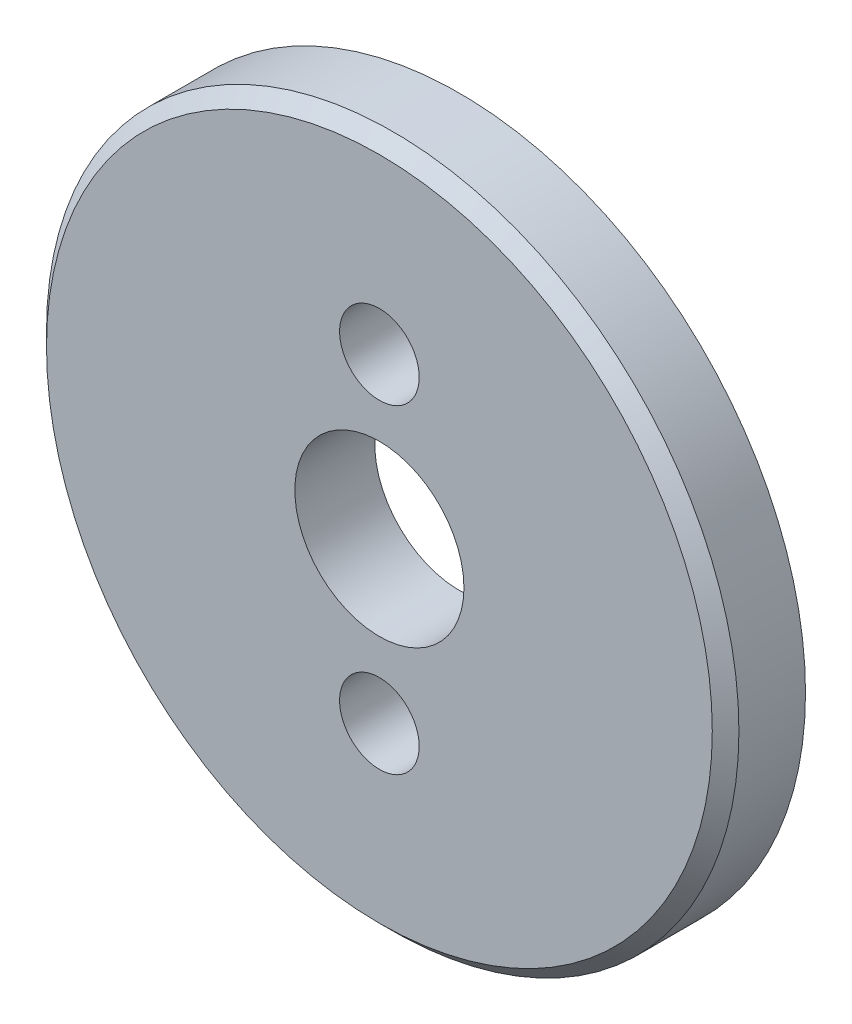
ISO-10303-21;
HEADER;
FILE_DESCRIPTION(('STEP AP214'),'2;1');
FILE_NAME('part.step','',(''),(''),'','','');
FILE_SCHEMA(('AUTOMOTIVE_DESIGN { 1 0 10303 214 1 1 1 1 }'));
ENDSEC;
DATA;
#1=APPLICATION_CONTEXT('core data for automotive mechanical design processes');
#2=APPLICATION_PROTOCOL_DEFINITION('international standard','automotive_design',2000,#1);
#3=PRODUCT_CONTEXT('',#1,'mechanical');
#4=PRODUCT('Part','Part','',(#3));
#5=PRODUCT_RELATED_PRODUCT_CATEGORY('part','',(#4));
#6=PRODUCT_DEFINITION_FORMATION('','',#4);
#7=PRODUCT_DEFINITION_CONTEXT('part definition',#1,'design');
#8=PRODUCT_DEFINITION('design','',#6,#7);
#9=PRODUCT_DEFINITION_SHAPE('','',#8);
#10=(LENGTH_UNIT() NAMED_UNIT(*) SI_UNIT(.MILLI.,.METRE.));
#11=(NAMED_UNIT(*) PLANE_ANGLE_UNIT() SI_UNIT($,.RADIAN.));
#12=(NAMED_UNIT(*) SI_UNIT($,.STERADIAN.) SOLID_ANGLE_UNIT());
#13=UNCERTAINTY_MEASURE_WITH_UNIT(LENGTH_MEASURE(1.E-05),#10,'distance_accuracy_value','');
#14=(GEOMETRIC_REPRESENTATION_CONTEXT(3) GLOBAL_UNCERTAINTY_ASSIGNED_CONTEXT((#13)) GLOBAL_UNIT_ASSIGNED_CONTEXT((#10,
#11,#12)) REPRESENTATION_CONTEXT('',''));
#15=CARTESIAN_POINT('',(0.,0.,0.));
#16=DIRECTION('',(0.,0.,1.));
#17=DIRECTION('',(1.,0.,0.));
#18=AXIS2_PLACEMENT_3D('',#15,#16,#17);
#19=CARTESIAN_POINT('',(0.,0.,3.));
#20=DIRECTION('',(0.,0.,1.));
#21=DIRECTION('',(1.,0.,0.));
#22=AXIS2_PLACEMENT_3D('',#19,#20,#21);
#23=PLANE('',#22);
#24=CARTESIAN_POINT('',(0.,0.,3.));
#25=DIRECTION('',(0.,0.,1.));
#26=DIRECTION('',(1.,0.,0.));
#27=AXIS2_PLACEMENT_3D('',#24,#25,#26);
#28=CIRCLE('',#27,12.5);
#29=CARTESIAN_POINT('',(12.5,0.,3.));
#30=VERTEX_POINT('',#29);
#31=EDGE_CURVE('E35',#30,#30,#28,.T.);
#32=ORIENTED_EDGE('',*,*,#31,.T.);
#33=EDGE_LOOP('',(#32));
#34=FACE_BOUND('',#33,.T.);
#35=CARTESIAN_POINT('',(0.,6.,3.));
#36=DIRECTION('',(0.,0.,1.));
#37=DIRECTION('',(1.,0.,0.));
#38=AXIS2_PLACEMENT_3D('',#35,#36,#37);
#39=CIRCLE('',#38,1.49440531887485);
#40=CARTESIAN_POINT('',(1.49440531887485,6.,3.));
#41=VERTEX_POINT('',#40);
#42=EDGE_CURVE('E49',#41,#41,#39,.T.);
#43=ORIENTED_EDGE('',*,*,#42,.F.);
#44=EDGE_LOOP('',(#43));
#45=FACE_BOUND('',#44,.T.);
#46=CARTESIAN_POINT('',(0.,0.,3.));
#47=DIRECTION('',(0.,0.,1.));
#48=DIRECTION('',(1.,0.,0.));
#49=AXIS2_PLACEMENT_3D('',#46,#47,#48);
#50=CIRCLE('',#49,3.175);
#51=CARTESIAN_POINT('',(3.175,0.,3.));
#52=VERTEX_POINT('',#51);
#53=EDGE_CURVE('E43',#52,#52,#50,.T.);
#54=ORIENTED_EDGE('',*,*,#53,.F.);
#55=EDGE_LOOP('',(#54));
#56=FACE_BOUND('',#55,.T.);
#57=CARTESIAN_POINT('',(0.,-6.,3.));
#58=DIRECTION('',(0.,0.,1.));
#59=DIRECTION('',(1.,0.,0.));
#60=AXIS2_PLACEMENT_3D('',#57,#58,#59);
#61=CIRCLE('',#60,1.49440531887485);
#62=CARTESIAN_POINT('',(1.49440531887481,-6.,3.));
#63=VERTEX_POINT('',#62);
#64=EDGE_CURVE('E55',#63,#63,#61,.T.);
#65=ORIENTED_EDGE('',*,*,#64,.F.);
#66=EDGE_LOOP('',(#65));
#67=FACE_BOUND('',#66,.T.);
#68=ADVANCED_FACE('F28',(#34,#45,#56,#67),#23,.T.);
#69=CARTESIAN_POINT('',(0.,0.,0.));
#70=DIRECTION('',(0.,0.,1.));
#71=DIRECTION('',(1.,0.,0.));
#72=AXIS2_PLACEMENT_3D('',#69,#70,#71);
#73=PLANE('',#72);
#74=CARTESIAN_POINT('',(0.,6.,0.));
#75=DIRECTION('',(0.,0.,1.));
#76=DIRECTION('',(1.,0.,0.));
#77=AXIS2_PLACEMENT_3D('',#74,#75,#76);
#78=CIRCLE('',#77,1.49440531887485);
#79=CARTESIAN_POINT('',(1.49440531887485,6.,0.));
#80=VERTEX_POINT('',#79);
#81=EDGE_CURVE('E52',#80,#80,#78,.T.);
#82=ORIENTED_EDGE('',*,*,#81,.T.);
#83=EDGE_LOOP('',(#82));
#84=FACE_BOUND('',#83,.T.);
#85=CARTESIAN_POINT('',(0.,0.,0.));
#86=DIRECTION('',(0.,0.,1.));
#87=DIRECTION('',(1.,0.,0.));
#88=AXIS2_PLACEMENT_3D('',#85,#86,#87);
#89=CIRCLE('',#88,13.);
#90=CARTESIAN_POINT('',(13.,0.,0.));
#91=VERTEX_POINT('',#90);
#92=EDGE_CURVE('E39',#91,#91,#89,.T.);
#93=ORIENTED_EDGE('',*,*,#92,.F.);
#94=EDGE_LOOP('',(#93));
#95=FACE_BOUND('',#94,.T.);
#96=CARTESIAN_POINT('',(0.,0.,0.));
#97=DIRECTION('',(0.,0.,1.));
#98=DIRECTION('',(1.,0.,0.));
#99=AXIS2_PLACEMENT_3D('',#96,#97,#98);
#100=CIRCLE('',#99,3.175);
#101=CARTESIAN_POINT('',(3.175,0.,0.));
#102=VERTEX_POINT('',#101);
#103=EDGE_CURVE('E46',#102,#102,#100,.T.);
#104=ORIENTED_EDGE('',*,*,#103,.T.);
#105=EDGE_LOOP('',(#104));
#106=FACE_BOUND('',#105,.T.);
#107=CARTESIAN_POINT('',(0.,-6.,0.));
#108=DIRECTION('',(0.,0.,1.));
#109=DIRECTION('',(1.,0.,0.));
#110=AXIS2_PLACEMENT_3D('',#107,#108,#109);
#111=CIRCLE('',#110,1.49440531887485);
#112=CARTESIAN_POINT('',(1.49440531887481,-6.,0.));
#113=VERTEX_POINT('',#112);
#114=EDGE_CURVE('E58',#113,#113,#111,.T.);
#115=ORIENTED_EDGE('',*,*,#114,.T.);
#116=EDGE_LOOP('',(#115));
#117=FACE_BOUND('',#116,.T.);
#118=ADVANCED_FACE('F68',(#84,#95,#106,#117),#73,.F.);
#119=CARTESIAN_POINT('',(0.,0.,3.));
#120=DIRECTION('',(0.,0.,-1.));
#121=DIRECTION('',(-1.,0.,0.));
#122=AXIS2_PLACEMENT_3D('',#119,#120,#121);
#123=CYLINDRICAL_SURFACE('',#122,13.);
#124=CARTESIAN_POINT('',(0.,0.,2.5));
#125=DIRECTION('',(0.,0.,1.));
#126=DIRECTION('',(1.,0.,0.));
#127=AXIS2_PLACEMENT_3D('',#124,#125,#126);
#128=CIRCLE('',#127,13.);
#129=CARTESIAN_POINT('',(13.,0.,2.5));
#130=VERTEX_POINT('',#129);
#131=EDGE_CURVE('E10',#130,#130,#128,.F.);
#132=ORIENTED_EDGE('',*,*,#131,.T.);
#133=EDGE_LOOP('',(#132));
#134=FACE_BOUND('',#133,.T.);
#135=ORIENTED_EDGE('',*,*,#92,.T.);
#136=EDGE_LOOP('',(#135));
#137=FACE_BOUND('',#136,.T.);
#138=ADVANCED_FACE('F73',(#134,#137),#123,.T.);
#139=CARTESIAN_POINT('',(0.,0.,3.));
#140=DIRECTION('',(0.,0.,-1.));
#141=DIRECTION('',(-1.,0.,0.));
#142=AXIS2_PLACEMENT_3D('',#139,#140,#141);
#143=CYLINDRICAL_SURFACE('',#142,3.175);
#144=ORIENTED_EDGE('',*,*,#53,.T.);
#145=EDGE_LOOP('',(#144));
#146=FACE_BOUND('',#145,.T.);
#147=ORIENTED_EDGE('',*,*,#103,.F.);
#148=EDGE_LOOP('',(#147));
#149=FACE_BOUND('',#148,.T.);
#150=ADVANCED_FACE('F78',(#146,#149),#143,.F.);
#151=CARTESIAN_POINT('',(0.,6.,3.));
#152=DIRECTION('',(0.,0.,-1.));
#153=DIRECTION('',(-1.,0.,0.));
#154=AXIS2_PLACEMENT_3D('',#151,#152,#153);
#155=CYLINDRICAL_SURFACE('',#154,1.49440531887485);
#156=ORIENTED_EDGE('',*,*,#42,.T.);
#157=EDGE_LOOP('',(#156));
#158=FACE_BOUND('',#157,.T.);
#159=ORIENTED_EDGE('',*,*,#81,.F.);
#160=EDGE_LOOP('',(#159));
#161=FACE_BOUND('',#160,.T.);
#162=ADVANCED_FACE('F84',(#158,#161),#155,.F.);
#163=CARTESIAN_POINT('',(0.,-6.,3.));
#164=DIRECTION('',(0.,0.,-1.));
#165=DIRECTION('',(-1.,0.,0.));
#166=AXIS2_PLACEMENT_3D('',#163,#164,#165);
#167=CYLINDRICAL_SURFACE('',#166,1.49440531887485);
#168=ORIENTED_EDGE('',*,*,#64,.T.);
#169=EDGE_LOOP('',(#168));
#170=FACE_BOUND('',#169,.T.);
#171=ORIENTED_EDGE('',*,*,#114,.F.);
#172=EDGE_LOOP('',(#171));
#173=FACE_BOUND('',#172,.T.);
#174=ADVANCED_FACE('F64',(#170,#173),#167,.F.);
#175=CARTESIAN_POINT('',(0.,0.,3.));
#176=DIRECTION('',(0.,0.,-1.));
#177=DIRECTION('',(-1.,0.,0.));
#178=AXIS2_PLACEMENT_3D('',#175,#176,#177);
#179=CONICAL_SURFACE('',#178,12.5,0.785398163397443);
#180=ORIENTED_EDGE('',*,*,#131,.F.);
#181=EDGE_LOOP('',(#180));
#182=FACE_BOUND('',#181,.T.);
#183=ORIENTED_EDGE('',*,*,#31,.F.);
#184=EDGE_LOOP('',(#183));
#185=FACE_BOUND('',#184,.T.);
#186=ADVANCED_FACE('F30',(#182,#185),#179,.T.);
#187=CLOSED_SHELL('',(#68,#118,#138,#150,#162,#174,#186));
#188=MANIFOLD_SOLID_BREP('B2',#187);
#189=ADVANCED_BREP_SHAPE_REPRESENTATION('',(#18,#188),#14);
#190=SHAPE_DEFINITION_REPRESENTATION(#9,#189);
ENDSEC;
END-ISO-10303-21;
